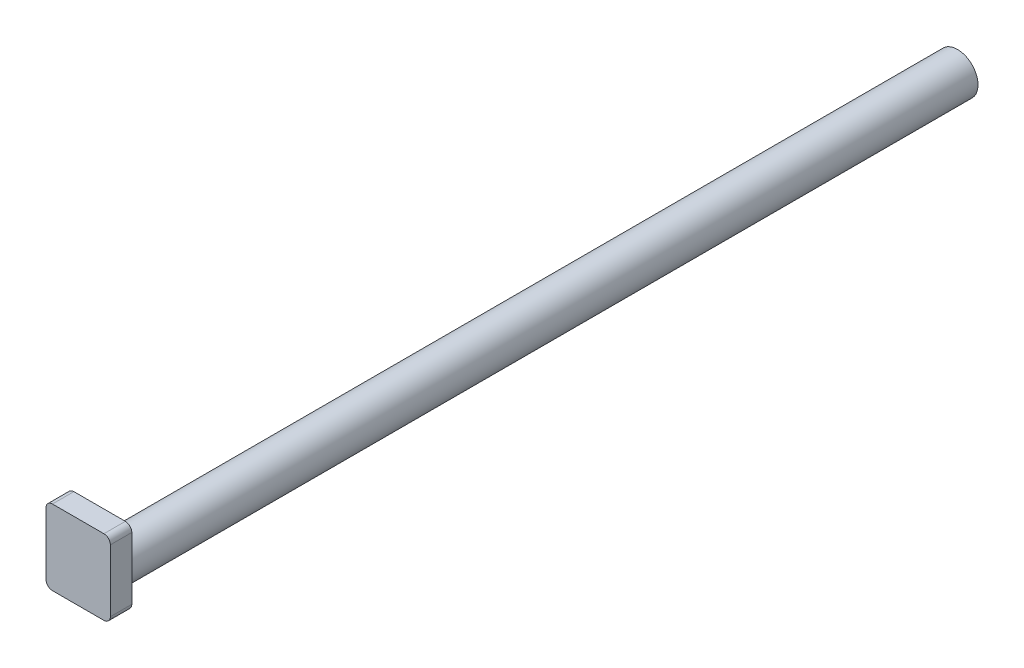
ISO-10303-21;
HEADER;
FILE_DESCRIPTION(('STEP AP214'),'2;1');
FILE_NAME('part.step','',(''),(''),'','','');
FILE_SCHEMA(('AUTOMOTIVE_DESIGN { 1 0 10303 214 1 1 1 1 }'));
ENDSEC;
DATA;
#1=APPLICATION_CONTEXT('core data for automotive mechanical design processes');
#2=APPLICATION_PROTOCOL_DEFINITION('international standard','automotive_design',2000,#1);
#3=PRODUCT_CONTEXT('',#1,'mechanical');
#4=PRODUCT('Part','Part','',(#3));
#5=PRODUCT_RELATED_PRODUCT_CATEGORY('part','',(#4));
#6=PRODUCT_DEFINITION_FORMATION('','',#4);
#7=PRODUCT_DEFINITION_CONTEXT('part definition',#1,'design');
#8=PRODUCT_DEFINITION('design','',#6,#7);
#9=PRODUCT_DEFINITION_SHAPE('','',#8);
#10=(LENGTH_UNIT() NAMED_UNIT(*) SI_UNIT(.MILLI.,.METRE.));
#11=(NAMED_UNIT(*) PLANE_ANGLE_UNIT() SI_UNIT($,.RADIAN.));
#12=(NAMED_UNIT(*) SI_UNIT($,.STERADIAN.) SOLID_ANGLE_UNIT());
#13=UNCERTAINTY_MEASURE_WITH_UNIT(LENGTH_MEASURE(1.E-05),#10,'distance_accuracy_value','');
#14=(GEOMETRIC_REPRESENTATION_CONTEXT(3) GLOBAL_UNCERTAINTY_ASSIGNED_CONTEXT((#13)) GLOBAL_UNIT_ASSIGNED_CONTEXT((#10,
#11,#12)) REPRESENTATION_CONTEXT('',''));
#15=CARTESIAN_POINT('',(0.,0.,0.));
#16=DIRECTION('',(0.,0.,1.));
#17=DIRECTION('',(1.,0.,0.));
#18=AXIS2_PLACEMENT_3D('',#15,#16,#17);
#19=CARTESIAN_POINT('',(0.,0.,400.));
#20=DIRECTION('',(0.,0.,-1.));
#21=DIRECTION('',(-1.,0.,0.));
#22=AXIS2_PLACEMENT_3D('',#19,#20,#21);
#23=CYLINDRICAL_SURFACE('',#22,9.525);
#24=CARTESIAN_POINT('',(0.,0.,400.));
#25=DIRECTION('',(0.,0.,1.));
#26=DIRECTION('',(1.,0.,0.));
#27=AXIS2_PLACEMENT_3D('',#24,#25,#26);
#28=CIRCLE('',#27,9.525);
#29=CARTESIAN_POINT('',(9.525,0.,400.));
#30=VERTEX_POINT('',#29);
#31=EDGE_CURVE('E132',#30,#30,#28,.T.);
#32=ORIENTED_EDGE('',*,*,#31,.F.);
#33=EDGE_LOOP('',(#32));
#34=FACE_BOUND('',#33,.T.);
#35=CARTESIAN_POINT('',(0.,0.,0.));
#36=DIRECTION('',(0.,0.,1.));
#37=DIRECTION('',(1.,0.,0.));
#38=AXIS2_PLACEMENT_3D('',#35,#36,#37);
#39=CIRCLE('',#38,9.525);
#40=CARTESIAN_POINT('',(9.525,0.,0.));
#41=VERTEX_POINT('',#40);
#42=EDGE_CURVE('E135',#41,#41,#39,.T.);
#43=ORIENTED_EDGE('',*,*,#42,.T.);
#44=EDGE_LOOP('',(#43));
#45=FACE_BOUND('',#44,.T.);
#46=ADVANCED_FACE('F33',(#34,#45),#23,.T.);
#47=CARTESIAN_POINT('',(0.,0.,0.));
#48=DIRECTION('',(0.,0.,1.));
#49=DIRECTION('',(1.,0.,0.));
#50=AXIS2_PLACEMENT_3D('',#47,#48,#49);
#51=PLANE('',#50);
#52=ORIENTED_EDGE('',*,*,#42,.F.);
#53=EDGE_LOOP('',(#52));
#54=FACE_BOUND('',#53,.T.);
#55=ADVANCED_FACE('F192',(#54),#51,.F.);
#56=CARTESIAN_POINT('',(-15.,-10.,410.));
#57=DIRECTION('',(1.,0.,0.));
#58=DIRECTION('',(0.,0.,-1.));
#59=AXIS2_PLACEMENT_3D('',#56,#57,#58);
#60=PLANE('',#59);
#61=DIRECTION('',(0.,-1.,0.));
#62=VECTOR('',#61,1.);
#63=CARTESIAN_POINT('',(-15.,-10.,400.));
#64=LINE('',#63,#62);
#65=CARTESIAN_POINT('',(-15.,22.,400.));
#66=VERTEX_POINT('',#65);
#67=CARTESIAN_POINT('',(-15.,-7.,400.));
#68=VERTEX_POINT('',#67);
#69=EDGE_CURVE('E128',#66,#68,#64,.T.);
#70=ORIENTED_EDGE('',*,*,#69,.T.);
#71=DIRECTION('',(0.,0.,-1.));
#72=VECTOR('',#71,1.);
#73=CARTESIAN_POINT('',(-15.,-7.,410.));
#74=LINE('',#73,#72);
#75=CARTESIAN_POINT('',(-15.,-7.,410.));
#76=VERTEX_POINT('',#75);
#77=EDGE_CURVE('E157',#68,#76,#74,.F.);
#78=ORIENTED_EDGE('',*,*,#77,.T.);
#79=DIRECTION('',(0.,-1.,0.));
#80=VECTOR('',#79,1.);
#81=CARTESIAN_POINT('',(-15.,-10.,410.));
#82=LINE('',#81,#80);
#83=CARTESIAN_POINT('',(-15.,22.,410.));
#84=VERTEX_POINT('',#83);
#85=EDGE_CURVE('E126',#84,#76,#82,.T.);
#86=ORIENTED_EDGE('',*,*,#85,.F.);
#87=DIRECTION('',(0.,0.,-1.));
#88=VECTOR('',#87,1.);
#89=CARTESIAN_POINT('',(-15.,22.,410.));
#90=LINE('',#89,#88);
#91=EDGE_CURVE('E154',#84,#66,#90,.T.);
#92=ORIENTED_EDGE('',*,*,#91,.T.);
#93=EDGE_LOOP('',(#70,#78,#86,#92));
#94=FACE_BOUND('',#93,.T.);
#95=ADVANCED_FACE('F170',(#94),#60,.F.);
#96=CARTESIAN_POINT('',(15.,-10.,410.));
#97=DIRECTION('',(0.,1.,0.));
#98=DIRECTION('',(0.,0.,1.));
#99=AXIS2_PLACEMENT_3D('',#96,#97,#98);
#100=PLANE('',#99);
#101=DIRECTION('',(1.,0.,0.));
#102=VECTOR('',#101,1.);
#103=CARTESIAN_POINT('',(15.,-10.,400.));
#104=LINE('',#103,#102);
#105=CARTESIAN_POINT('',(-12.,-10.,400.));
#106=VERTEX_POINT('',#105);
#107=CARTESIAN_POINT('',(12.,-10.,400.));
#108=VERTEX_POINT('',#107);
#109=EDGE_CURVE('E124',#106,#108,#104,.T.);
#110=ORIENTED_EDGE('',*,*,#109,.T.);
#111=DIRECTION('',(0.,0.,-1.));
#112=VECTOR('',#111,1.);
#113=CARTESIAN_POINT('',(12.,-10.,410.));
#114=LINE('',#113,#112);
#115=CARTESIAN_POINT('',(12.,-10.,410.));
#116=VERTEX_POINT('',#115);
#117=EDGE_CURVE('E103',#108,#116,#114,.F.);
#118=ORIENTED_EDGE('',*,*,#117,.T.);
#119=DIRECTION('',(1.,0.,0.));
#120=VECTOR('',#119,1.);
#121=CARTESIAN_POINT('',(15.,-10.,410.));
#122=LINE('',#121,#120);
#123=CARTESIAN_POINT('',(-12.,-10.,410.));
#124=VERTEX_POINT('',#123);
#125=EDGE_CURVE('E174',#124,#116,#122,.T.);
#126=ORIENTED_EDGE('',*,*,#125,.F.);
#127=DIRECTION('',(0.,0.,-1.));
#128=VECTOR('',#127,1.);
#129=CARTESIAN_POINT('',(-12.,-10.,410.));
#130=LINE('',#129,#128);
#131=EDGE_CURVE('E108',#124,#106,#130,.T.);
#132=ORIENTED_EDGE('',*,*,#131,.T.);
#133=EDGE_LOOP('',(#110,#118,#126,#132));
#134=FACE_BOUND('',#133,.T.);
#135=ADVANCED_FACE('F256',(#134),#100,.F.);
#136=CARTESIAN_POINT('',(15.,-10.,410.));
#137=DIRECTION('',(-1.,0.,0.));
#138=DIRECTION('',(0.,0.,1.));
#139=AXIS2_PLACEMENT_3D('',#136,#137,#138);
#140=PLANE('',#139);
#141=DIRECTION('',(0.,1.,0.));
#142=VECTOR('',#141,1.);
#143=CARTESIAN_POINT('',(15.,-10.,410.));
#144=LINE('',#143,#142);
#145=CARTESIAN_POINT('',(15.,-7.,410.));
#146=VERTEX_POINT('',#145);
#147=CARTESIAN_POINT('',(15.,22.,410.));
#148=VERTEX_POINT('',#147);
#149=EDGE_CURVE('E117',#146,#148,#144,.T.);
#150=ORIENTED_EDGE('',*,*,#149,.F.);
#151=DIRECTION('',(0.,0.,-1.));
#152=VECTOR('',#151,1.);
#153=CARTESIAN_POINT('',(15.,-7.,410.));
#154=LINE('',#153,#152);
#155=CARTESIAN_POINT('',(15.,-7.,400.));
#156=VERTEX_POINT('',#155);
#157=EDGE_CURVE('E102',#146,#156,#154,.T.);
#158=ORIENTED_EDGE('',*,*,#157,.T.);
#159=DIRECTION('',(0.,1.,0.));
#160=VECTOR('',#159,1.);
#161=CARTESIAN_POINT('',(15.,-10.,400.));
#162=LINE('',#161,#160);
#163=CARTESIAN_POINT('',(15.,22.,400.));
#164=VERTEX_POINT('',#163);
#165=EDGE_CURVE('E115',#156,#164,#162,.T.);
#166=ORIENTED_EDGE('',*,*,#165,.T.);
#167=DIRECTION('',(0.,0.,-1.));
#168=VECTOR('',#167,1.);
#169=CARTESIAN_POINT('',(15.,22.,410.));
#170=LINE('',#169,#168);
#171=EDGE_CURVE('E119',#164,#148,#170,.F.);
#172=ORIENTED_EDGE('',*,*,#171,.T.);
#173=EDGE_LOOP('',(#150,#158,#166,#172));
#174=FACE_BOUND('',#173,.T.);
#175=ADVANCED_FACE('F114',(#174),#140,.F.);
#176=CARTESIAN_POINT('',(15.,25.,410.));
#177=DIRECTION('',(0.,-1.,0.));
#178=DIRECTION('',(0.,0.,-1.));
#179=AXIS2_PLACEMENT_3D('',#176,#177,#178);
#180=PLANE('',#179);
#181=DIRECTION('',(-1.,0.,0.));
#182=VECTOR('',#181,1.);
#183=CARTESIAN_POINT('',(15.,25.,400.));
#184=LINE('',#183,#182);
#185=CARTESIAN_POINT('',(12.,25.,400.));
#186=VERTEX_POINT('',#185);
#187=CARTESIAN_POINT('',(-12.,25.,400.));
#188=VERTEX_POINT('',#187);
#189=EDGE_CURVE('E123',#186,#188,#184,.T.);
#190=ORIENTED_EDGE('',*,*,#189,.T.);
#191=DIRECTION('',(0.,0.,-1.));
#192=VECTOR('',#191,1.);
#193=CARTESIAN_POINT('',(-12.,25.,410.));
#194=LINE('',#193,#192);
#195=CARTESIAN_POINT('',(-12.,25.,410.));
#196=VERTEX_POINT('',#195);
#197=EDGE_CURVE('E11',#188,#196,#194,.F.);
#198=ORIENTED_EDGE('',*,*,#197,.T.);
#199=DIRECTION('',(-1.,0.,0.));
#200=VECTOR('',#199,1.);
#201=CARTESIAN_POINT('',(15.,25.,410.));
#202=LINE('',#201,#200);
#203=CARTESIAN_POINT('',(12.,25.,410.));
#204=VERTEX_POINT('',#203);
#205=EDGE_CURVE('E138',#204,#196,#202,.T.);
#206=ORIENTED_EDGE('',*,*,#205,.F.);
#207=DIRECTION('',(0.,0.,-1.));
#208=VECTOR('',#207,1.);
#209=CARTESIAN_POINT('',(12.,25.,410.));
#210=LINE('',#209,#208);
#211=EDGE_CURVE('E41',#204,#186,#210,.T.);
#212=ORIENTED_EDGE('',*,*,#211,.T.);
#213=EDGE_LOOP('',(#190,#198,#206,#212));
#214=FACE_BOUND('',#213,.T.);
#215=ADVANCED_FACE('F160',(#214),#180,.F.);
#216=CARTESIAN_POINT('',(0.,0.,410.));
#217=DIRECTION('',(0.,0.,1.));
#218=DIRECTION('',(1.,0.,0.));
#219=AXIS2_PLACEMENT_3D('',#216,#217,#218);
#220=PLANE('',#219);
#221=ORIENTED_EDGE('',*,*,#125,.T.);
#222=CARTESIAN_POINT('',(12.,-7.,410.));
#223=DIRECTION('',(0.,0.,1.));
#224=DIRECTION('',(1.,0.,0.));
#225=AXIS2_PLACEMENT_3D('',#222,#223,#224);
#226=CIRCLE('',#225,3.);
#227=EDGE_CURVE('E152',#116,#146,#226,.T.);
#228=ORIENTED_EDGE('',*,*,#227,.T.);
#229=ORIENTED_EDGE('',*,*,#149,.T.);
#230=CARTESIAN_POINT('',(12.,22.,410.));
#231=DIRECTION('',(0.,0.,1.));
#232=DIRECTION('',(1.,0.,0.));
#233=AXIS2_PLACEMENT_3D('',#230,#231,#232);
#234=CIRCLE('',#233,3.);
#235=EDGE_CURVE('E53',#148,#204,#234,.T.);
#236=ORIENTED_EDGE('',*,*,#235,.T.);
#237=ORIENTED_EDGE('',*,*,#205,.T.);
#238=CARTESIAN_POINT('',(-12.,22.,410.));
#239=DIRECTION('',(0.,0.,1.));
#240=DIRECTION('',(1.,0.,0.));
#241=AXIS2_PLACEMENT_3D('',#238,#239,#240);
#242=CIRCLE('',#241,3.);
#243=EDGE_CURVE('E148',#196,#84,#242,.T.);
#244=ORIENTED_EDGE('',*,*,#243,.T.);
#245=ORIENTED_EDGE('',*,*,#85,.T.);
#246=CARTESIAN_POINT('',(-12.,-7.,410.));
#247=DIRECTION('',(0.,0.,1.));
#248=DIRECTION('',(1.,0.,0.));
#249=AXIS2_PLACEMENT_3D('',#246,#247,#248);
#250=CIRCLE('',#249,3.);
#251=EDGE_CURVE('E150',#76,#124,#250,.T.);
#252=ORIENTED_EDGE('',*,*,#251,.T.);
#253=EDGE_LOOP('',(#221,#228,#229,#236,#237,#244,#245,#252));
#254=FACE_BOUND('',#253,.T.);
#255=ADVANCED_FACE('F180',(#254),#220,.T.);
#256=CARTESIAN_POINT('',(0.,0.,400.));
#257=DIRECTION('',(0.,0.,1.));
#258=DIRECTION('',(1.,0.,0.));
#259=AXIS2_PLACEMENT_3D('',#256,#257,#258);
#260=PLANE('',#259);
#261=ORIENTED_EDGE('',*,*,#31,.T.);
#262=EDGE_LOOP('',(#261));
#263=FACE_BOUND('',#262,.T.);
#264=ORIENTED_EDGE('',*,*,#165,.F.);
#265=CARTESIAN_POINT('',(12.,-7.,400.));
#266=DIRECTION('',(0.,0.,1.));
#267=DIRECTION('',(1.,0.,0.));
#268=AXIS2_PLACEMENT_3D('',#265,#266,#267);
#269=CIRCLE('',#268,3.);
#270=EDGE_CURVE('E98',#156,#108,#269,.F.);
#271=ORIENTED_EDGE('',*,*,#270,.T.);
#272=ORIENTED_EDGE('',*,*,#109,.F.);
#273=CARTESIAN_POINT('',(-12.,-7.,400.));
#274=DIRECTION('',(0.,0.,1.));
#275=DIRECTION('',(1.,0.,0.));
#276=AXIS2_PLACEMENT_3D('',#273,#274,#275);
#277=CIRCLE('',#276,3.);
#278=EDGE_CURVE('E109',#106,#68,#277,.F.);
#279=ORIENTED_EDGE('',*,*,#278,.T.);
#280=ORIENTED_EDGE('',*,*,#69,.F.);
#281=CARTESIAN_POINT('',(-12.,22.,400.));
#282=DIRECTION('',(0.,0.,1.));
#283=DIRECTION('',(1.,0.,0.));
#284=AXIS2_PLACEMENT_3D('',#281,#282,#283);
#285=CIRCLE('',#284,3.);
#286=EDGE_CURVE('E141',#66,#188,#285,.F.);
#287=ORIENTED_EDGE('',*,*,#286,.T.);
#288=ORIENTED_EDGE('',*,*,#189,.F.);
#289=CARTESIAN_POINT('',(12.,22.,400.));
#290=DIRECTION('',(0.,0.,1.));
#291=DIRECTION('',(1.,0.,0.));
#292=AXIS2_PLACEMENT_3D('',#289,#290,#291);
#293=CIRCLE('',#292,3.);
#294=EDGE_CURVE('E118',#186,#164,#293,.F.);
#295=ORIENTED_EDGE('',*,*,#294,.T.);
#296=EDGE_LOOP('',(#264,#271,#272,#279,#280,#287,#288,#295));
#297=FACE_BOUND('',#296,.T.);
#298=ADVANCED_FACE('F121',(#263,#297),#260,.F.);
#299=CARTESIAN_POINT('',(12.,-7.,410.));
#300=DIRECTION('',(0.,0.,-1.));
#301=DIRECTION('',(-1.,0.,0.));
#302=AXIS2_PLACEMENT_3D('',#299,#300,#301);
#303=CYLINDRICAL_SURFACE('',#302,3.);
#304=ORIENTED_EDGE('',*,*,#227,.F.);
#305=ORIENTED_EDGE('',*,*,#117,.F.);
#306=ORIENTED_EDGE('',*,*,#270,.F.);
#307=ORIENTED_EDGE('',*,*,#157,.F.);
#308=EDGE_LOOP('',(#304,#305,#306,#307));
#309=FACE_BOUND('',#308,.T.);
#310=ADVANCED_FACE('F101',(#309),#303,.T.);
#311=CARTESIAN_POINT('',(-12.,-7.,410.));
#312=DIRECTION('',(0.,0.,-1.));
#313=DIRECTION('',(-1.,0.,0.));
#314=AXIS2_PLACEMENT_3D('',#311,#312,#313);
#315=CYLINDRICAL_SURFACE('',#314,3.);
#316=ORIENTED_EDGE('',*,*,#251,.F.);
#317=ORIENTED_EDGE('',*,*,#77,.F.);
#318=ORIENTED_EDGE('',*,*,#278,.F.);
#319=ORIENTED_EDGE('',*,*,#131,.F.);
#320=EDGE_LOOP('',(#316,#317,#318,#319));
#321=FACE_BOUND('',#320,.T.);
#322=ADVANCED_FACE('F206',(#321),#315,.T.);
#323=CARTESIAN_POINT('',(-12.,22.,410.));
#324=DIRECTION('',(0.,0.,-1.));
#325=DIRECTION('',(-1.,0.,0.));
#326=AXIS2_PLACEMENT_3D('',#323,#324,#325);
#327=CYLINDRICAL_SURFACE('',#326,3.);
#328=ORIENTED_EDGE('',*,*,#243,.F.);
#329=ORIENTED_EDGE('',*,*,#197,.F.);
#330=ORIENTED_EDGE('',*,*,#286,.F.);
#331=ORIENTED_EDGE('',*,*,#91,.F.);
#332=EDGE_LOOP('',(#328,#329,#330,#331));
#333=FACE_BOUND('',#332,.T.);
#334=ADVANCED_FACE('F167',(#333),#327,.T.);
#335=CARTESIAN_POINT('',(12.,22.,410.));
#336=DIRECTION('',(0.,0.,-1.));
#337=DIRECTION('',(-1.,0.,0.));
#338=AXIS2_PLACEMENT_3D('',#335,#336,#337);
#339=CYLINDRICAL_SURFACE('',#338,3.);
#340=ORIENTED_EDGE('',*,*,#235,.F.);
#341=ORIENTED_EDGE('',*,*,#171,.F.);
#342=ORIENTED_EDGE('',*,*,#294,.F.);
#343=ORIENTED_EDGE('',*,*,#211,.F.);
#344=EDGE_LOOP('',(#340,#341,#342,#343));
#345=FACE_BOUND('',#344,.T.);
#346=ADVANCED_FACE('F35',(#345),#339,.T.);
#347=CLOSED_SHELL('',(#46,#55,#95,#135,#175,#215,#255,#298,#310,#322,#334,#346));
#348=MANIFOLD_SOLID_BREP('B2',#347);
#349=ADVANCED_BREP_SHAPE_REPRESENTATION('',(#18,#348),#14);
#350=SHAPE_DEFINITION_REPRESENTATION(#9,#349);
ENDSEC;
END-ISO-10303-21;
